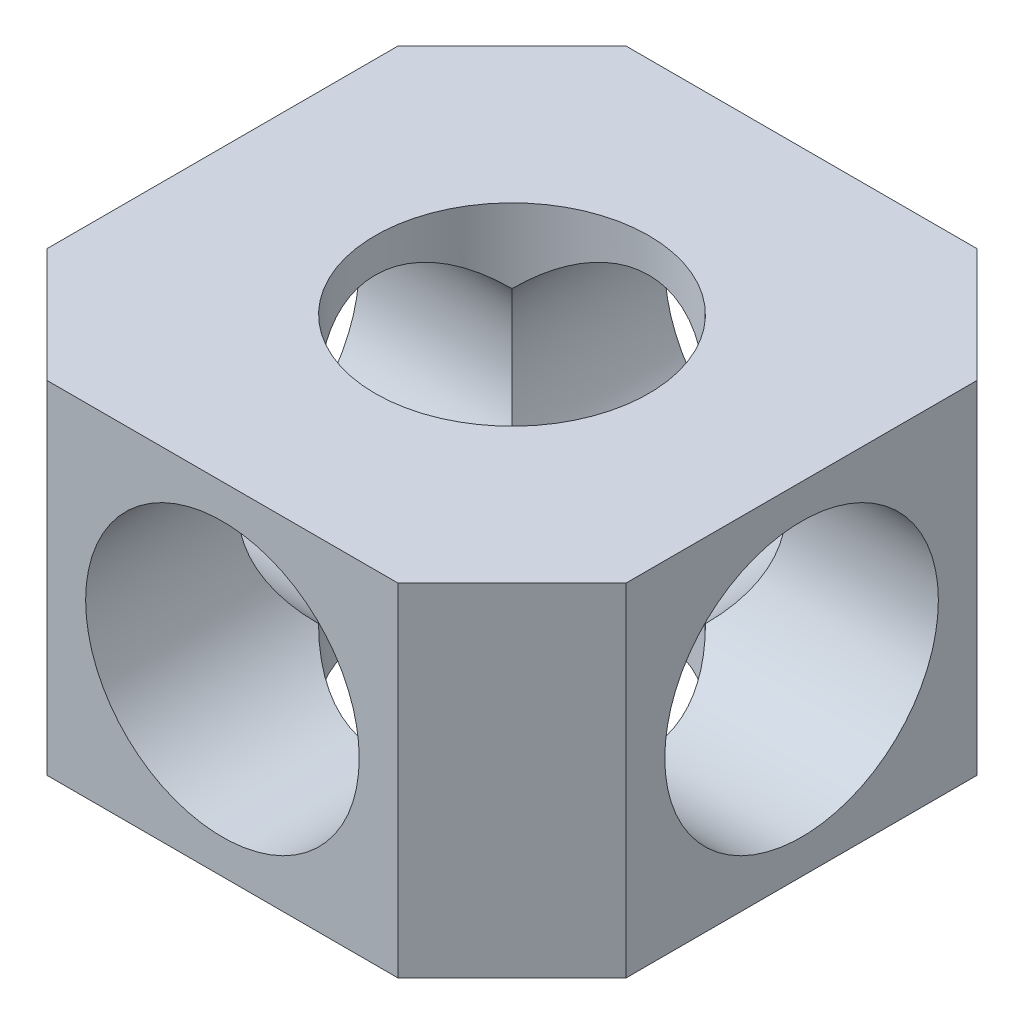
ISO-10303-21;
HEADER;
FILE_DESCRIPTION(('STEP AP214'),'2;1');
FILE_NAME('part.step','',(''),(''),'','','');
FILE_SCHEMA(('AUTOMOTIVE_DESIGN { 1 0 10303 214 1 1 1 1 }'));
ENDSEC;
DATA;
#1=APPLICATION_CONTEXT('core data for automotive mechanical design processes');
#2=APPLICATION_PROTOCOL_DEFINITION('international standard','automotive_design',2000,#1);
#3=PRODUCT_CONTEXT('',#1,'mechanical');
#4=PRODUCT('Part','Part','',(#3));
#5=PRODUCT_RELATED_PRODUCT_CATEGORY('part','',(#4));
#6=PRODUCT_DEFINITION_FORMATION('','',#4);
#7=PRODUCT_DEFINITION_CONTEXT('part definition',#1,'design');
#8=PRODUCT_DEFINITION('design','',#6,#7);
#9=PRODUCT_DEFINITION_SHAPE('','',#8);
#10=(LENGTH_UNIT() NAMED_UNIT(*) SI_UNIT(.MILLI.,.METRE.));
#11=(NAMED_UNIT(*) PLANE_ANGLE_UNIT() SI_UNIT($,.RADIAN.));
#12=(NAMED_UNIT(*) SI_UNIT($,.STERADIAN.) SOLID_ANGLE_UNIT());
#13=UNCERTAINTY_MEASURE_WITH_UNIT(LENGTH_MEASURE(1.E-05),#10,'distance_accuracy_value','');
#14=(GEOMETRIC_REPRESENTATION_CONTEXT(3) GLOBAL_UNCERTAINTY_ASSIGNED_CONTEXT((#13)) GLOBAL_UNIT_ASSIGNED_CONTEXT((#10,
#11,#12)) REPRESENTATION_CONTEXT('',''));
#15=CARTESIAN_POINT('',(0.,0.,0.));
#16=DIRECTION('',(0.,0.,1.));
#17=DIRECTION('',(1.,0.,0.));
#18=AXIS2_PLACEMENT_3D('',#15,#16,#17);
#19=CARTESIAN_POINT('',(0.,-7.5,0.));
#20=DIRECTION('',(0.,1.,0.));
#21=DIRECTION('',(0.,0.,1.));
#22=AXIS2_PLACEMENT_3D('',#19,#20,#21);
#23=CYLINDRICAL_SURFACE('',#22,6.);
#24=CARTESIAN_POINT('',(0.,7.5,0.));
#25=DIRECTION('',(0.,1.,0.));
#26=DIRECTION('',(0.,0.,1.));
#27=AXIS2_PLACEMENT_3D('',#24,#25,#26);
#28=CIRCLE('',#27,6.);
#29=CARTESIAN_POINT('',(0.,7.5,6.));
#30=VERTEX_POINT('',#29);
#31=EDGE_CURVE('E173',#30,#30,#28,.T.);
#32=ORIENTED_EDGE('',*,*,#31,.T.);
#33=EDGE_LOOP('',(#32));
#34=FACE_BOUND('',#33,.T.);
#35=CARTESIAN_POINT('',(0.,0.,0.));
#36=DIRECTION('',(0.,0.707106781186547,-0.707106781186547));
#37=DIRECTION('',(0.,0.707106781186547,0.707106781186547));
#38=AXIS2_PLACEMENT_3D('',#35,#36,#37);
#39=ELLIPSE('',#38,8.48528137423857,6.);
#40=CARTESIAN_POINT('',(4.2426406871193,4.24264068711927,4.24264068711926));
#41=VERTEX_POINT('',#40);
#42=CARTESIAN_POINT('',(-4.24264068711927,4.2426406871193,4.24264068711931));
#43=VERTEX_POINT('',#42);
#44=EDGE_CURVE('E135',#41,#43,#39,.F.);
#45=ORIENTED_EDGE('',*,*,#44,.T.);
#46=CARTESIAN_POINT('',(0.,0.,0.));
#47=DIRECTION('',(0.707106781186547,0.707106781186547,0.));
#48=DIRECTION('',(-0.707106781186547,0.707106781186547,0.));
#49=AXIS2_PLACEMENT_3D('',#46,#47,#48);
#50=ELLIPSE('',#49,8.48528137423857,6.);
#51=CARTESIAN_POINT('',(-4.2426406871193,4.24264068711927,-4.24264068711926));
#52=VERTEX_POINT('',#51);
#53=EDGE_CURVE('E167',#43,#52,#50,.F.);
#54=ORIENTED_EDGE('',*,*,#53,.T.);
#55=CARTESIAN_POINT('',(0.,0.,0.));
#56=DIRECTION('',(0.,0.707106781186547,0.707106781186547));
#57=DIRECTION('',(0.,0.707106781186547,-0.707106781186547));
#58=AXIS2_PLACEMENT_3D('',#55,#56,#57);
#59=ELLIPSE('',#58,8.48528137423857,6.);
#60=CARTESIAN_POINT('',(4.24264068711928,4.24264068711929,-4.24264068711929));
#61=VERTEX_POINT('',#60);
#62=EDGE_CURVE('E137',#52,#61,#59,.F.);
#63=ORIENTED_EDGE('',*,*,#62,.T.);
#64=CARTESIAN_POINT('',(0.,0.,0.));
#65=DIRECTION('',(-0.707106781186547,0.707106781186547,0.));
#66=DIRECTION('',(0.707106781186547,0.707106781186547,0.));
#67=AXIS2_PLACEMENT_3D('',#64,#65,#66);
#68=ELLIPSE('',#67,8.48528137423857,6.);
#69=EDGE_CURVE('E50',#61,#41,#68,.F.);
#70=ORIENTED_EDGE('',*,*,#69,.T.);
#71=EDGE_LOOP('',(#45,#54,#63,#70));
#72=FACE_BOUND('',#71,.T.);
#73=ADVANCED_FACE('F35',(#34,#72),#23,.F.);
#74=CARTESIAN_POINT('',(12.7,7.5,-12.7));
#75=DIRECTION('',(-1.,0.,0.));
#76=DIRECTION('',(0.,0.,1.));
#77=AXIS2_PLACEMENT_3D('',#74,#75,#76);
#78=PLANE('',#77);
#79=CARTESIAN_POINT('',(12.7,0.,0.));
#80=DIRECTION('',(1.,0.,0.));
#81=DIRECTION('',(0.,0.,-1.));
#82=AXIS2_PLACEMENT_3D('',#79,#80,#81);
#83=CIRCLE('',#82,6.);
#84=CARTESIAN_POINT('',(12.7,0.,-6.00000000000005));
#85=VERTEX_POINT('',#84);
#86=EDGE_CURVE('E162',#85,#85,#83,.T.);
#87=ORIENTED_EDGE('',*,*,#86,.F.);
#88=EDGE_LOOP('',(#87));
#89=FACE_BOUND('',#88,.T.);
#90=DIRECTION('',(0.,0.,-1.));
#91=VECTOR('',#90,1.);
#92=CARTESIAN_POINT('',(12.7,-7.5,-12.7));
#93=LINE('',#92,#91);
#94=CARTESIAN_POINT('',(12.7,-7.5,7.69999999999997));
#95=VERTEX_POINT('',#94);
#96=CARTESIAN_POINT('',(12.7,-7.5,-7.69999999999998));
#97=VERTEX_POINT('',#96);
#98=EDGE_CURVE('E179',#95,#97,#93,.T.);
#99=ORIENTED_EDGE('',*,*,#98,.T.);
#100=DIRECTION('',(0.,1.,0.));
#101=VECTOR('',#100,1.);
#102=CARTESIAN_POINT('',(12.7,7.5,-7.69999999999998));
#103=LINE('',#102,#101);
#104=CARTESIAN_POINT('',(12.7,7.5,-7.69999999999998));
#105=VERTEX_POINT('',#104);
#106=EDGE_CURVE('E221',#97,#105,#103,.T.);
#107=ORIENTED_EDGE('',*,*,#106,.T.);
#108=DIRECTION('',(0.,0.,-1.));
#109=VECTOR('',#108,1.);
#110=CARTESIAN_POINT('',(12.7,7.5,-12.7));
#111=LINE('',#110,#109);
#112=CARTESIAN_POINT('',(12.7,7.5,7.69999999999997));
#113=VERTEX_POINT('',#112);
#114=EDGE_CURVE('E182',#113,#105,#111,.T.);
#115=ORIENTED_EDGE('',*,*,#114,.F.);
#116=DIRECTION('',(0.,-1.,0.));
#117=VECTOR('',#116,1.);
#118=CARTESIAN_POINT('',(12.7,7.5,7.69999999999997));
#119=LINE('',#118,#117);
#120=EDGE_CURVE('E218',#113,#95,#119,.T.);
#121=ORIENTED_EDGE('',*,*,#120,.T.);
#122=EDGE_LOOP('',(#99,#107,#115,#121));
#123=FACE_BOUND('',#122,.T.);
#124=ADVANCED_FACE('F250',(#89,#123),#78,.F.);
#125=CARTESIAN_POINT('',(-12.7,7.5,-12.7));
#126=DIRECTION('',(0.,0.,1.));
#127=DIRECTION('',(1.,0.,0.));
#128=AXIS2_PLACEMENT_3D('',#125,#126,#127);
#129=PLANE('',#128);
#130=CARTESIAN_POINT('',(0.,0.,-12.7));
#131=DIRECTION('',(0.,0.,1.));
#132=DIRECTION('',(1.,0.,0.));
#133=AXIS2_PLACEMENT_3D('',#130,#131,#132);
#134=CIRCLE('',#133,6.);
#135=CARTESIAN_POINT('',(6.,0.,-12.7));
#136=VERTEX_POINT('',#135);
#137=EDGE_CURVE('E170',#136,#136,#134,.T.);
#138=ORIENTED_EDGE('',*,*,#137,.T.);
#139=EDGE_LOOP('',(#138));
#140=FACE_BOUND('',#139,.T.);
#141=DIRECTION('',(-1.,0.,0.));
#142=VECTOR('',#141,1.);
#143=CARTESIAN_POINT('',(-12.7,7.5,-12.7));
#144=LINE('',#143,#142);
#145=CARTESIAN_POINT('',(7.69999999999993,7.5,-12.7));
#146=VERTEX_POINT('',#145);
#147=CARTESIAN_POINT('',(-7.7,7.5,-12.7));
#148=VERTEX_POINT('',#147);
#149=EDGE_CURVE('E185',#146,#148,#144,.T.);
#150=ORIENTED_EDGE('',*,*,#149,.F.);
#151=DIRECTION('',(0.,-1.,0.));
#152=VECTOR('',#151,1.);
#153=CARTESIAN_POINT('',(7.69999999999994,7.5,-12.7));
#154=LINE('',#153,#152);
#155=CARTESIAN_POINT('',(7.69999999999994,-7.5,-12.7));
#156=VERTEX_POINT('',#155);
#157=EDGE_CURVE('E207',#146,#156,#154,.T.);
#158=ORIENTED_EDGE('',*,*,#157,.T.);
#159=DIRECTION('',(-1.,0.,0.));
#160=VECTOR('',#159,1.);
#161=CARTESIAN_POINT('',(-12.7,-7.5,-12.7));
#162=LINE('',#161,#160);
#163=CARTESIAN_POINT('',(-7.7,-7.5,-12.7));
#164=VERTEX_POINT('',#163);
#165=EDGE_CURVE('E198',#156,#164,#162,.T.);
#166=ORIENTED_EDGE('',*,*,#165,.T.);
#167=DIRECTION('',(0.,1.,0.));
#168=VECTOR('',#167,1.);
#169=CARTESIAN_POINT('',(-7.7,7.5,-12.7));
#170=LINE('',#169,#168);
#171=EDGE_CURVE('E195',#164,#148,#170,.T.);
#172=ORIENTED_EDGE('',*,*,#171,.T.);
#173=EDGE_LOOP('',(#150,#158,#166,#172));
#174=FACE_BOUND('',#173,.T.);
#175=ADVANCED_FACE('F261',(#140,#174),#129,.F.);
#176=CARTESIAN_POINT('',(-12.7,7.5,-12.7));
#177=DIRECTION('',(1.,0.,0.));
#178=DIRECTION('',(0.,0.,-1.));
#179=AXIS2_PLACEMENT_3D('',#176,#177,#178);
#180=PLANE('',#179);
#181=CARTESIAN_POINT('',(-12.7000000000001,0.,0.));
#182=DIRECTION('',(1.,0.,0.));
#183=DIRECTION('',(0.,0.,-1.));
#184=AXIS2_PLACEMENT_3D('',#181,#182,#183);
#185=CIRCLE('',#184,6.);
#186=CARTESIAN_POINT('',(-12.7000000000001,0.,-5.99999999999996));
#187=VERTEX_POINT('',#186);
#188=EDGE_CURVE('E159',#187,#187,#185,.T.);
#189=ORIENTED_EDGE('',*,*,#188,.T.);
#190=EDGE_LOOP('',(#189));
#191=FACE_BOUND('',#190,.T.);
#192=DIRECTION('',(0.,0.,1.));
#193=VECTOR('',#192,1.);
#194=CARTESIAN_POINT('',(-12.7,7.5,-12.7));
#195=LINE('',#194,#193);
#196=CARTESIAN_POINT('',(-12.7,7.5,-7.69999999999998));
#197=VERTEX_POINT('',#196);
#198=CARTESIAN_POINT('',(-12.7,7.5,7.69999999999998));
#199=VERTEX_POINT('',#198);
#200=EDGE_CURVE('E189',#197,#199,#195,.T.);
#201=ORIENTED_EDGE('',*,*,#200,.F.);
#202=DIRECTION('',(0.,-1.,0.));
#203=VECTOR('',#202,1.);
#204=CARTESIAN_POINT('',(-12.7,7.5,-7.69999999999999));
#205=LINE('',#204,#203);
#206=CARTESIAN_POINT('',(-12.7,-7.5,-7.69999999999999));
#207=VERTEX_POINT('',#206);
#208=EDGE_CURVE('E233',#197,#207,#205,.T.);
#209=ORIENTED_EDGE('',*,*,#208,.T.);
#210=DIRECTION('',(0.,0.,1.));
#211=VECTOR('',#210,1.);
#212=CARTESIAN_POINT('',(-12.7,-7.5,-12.7));
#213=LINE('',#212,#211);
#214=CARTESIAN_POINT('',(-12.7,-7.5,7.69999999999998));
#215=VERTEX_POINT('',#214);
#216=EDGE_CURVE('E201',#207,#215,#213,.T.);
#217=ORIENTED_EDGE('',*,*,#216,.T.);
#218=DIRECTION('',(0.,1.,0.));
#219=VECTOR('',#218,1.);
#220=CARTESIAN_POINT('',(-12.7,7.5,7.69999999999998));
#221=LINE('',#220,#219);
#222=EDGE_CURVE('E231',#215,#199,#221,.T.);
#223=ORIENTED_EDGE('',*,*,#222,.T.);
#224=EDGE_LOOP('',(#201,#209,#217,#223));
#225=FACE_BOUND('',#224,.T.);
#226=ADVANCED_FACE('F270',(#191,#225),#180,.F.);
#227=CARTESIAN_POINT('',(-12.7,7.5,12.7));
#228=DIRECTION('',(0.,0.,-1.));
#229=DIRECTION('',(-1.,0.,0.));
#230=AXIS2_PLACEMENT_3D('',#227,#228,#229);
#231=PLANE('',#230);
#232=CARTESIAN_POINT('',(0.,0.,12.7));
#233=DIRECTION('',(0.,0.,1.));
#234=DIRECTION('',(1.,0.,0.));
#235=AXIS2_PLACEMENT_3D('',#232,#233,#234);
#236=CIRCLE('',#235,6.);
#237=CARTESIAN_POINT('',(6.,0.,12.7));
#238=VERTEX_POINT('',#237);
#239=EDGE_CURVE('E169',#238,#238,#236,.T.);
#240=ORIENTED_EDGE('',*,*,#239,.F.);
#241=EDGE_LOOP('',(#240));
#242=FACE_BOUND('',#241,.T.);
#243=DIRECTION('',(1.,0.,0.));
#244=VECTOR('',#243,1.);
#245=CARTESIAN_POINT('',(-12.7,7.5,12.7));
#246=LINE('',#245,#244);
#247=CARTESIAN_POINT('',(-7.70000000000001,7.5,12.7));
#248=VERTEX_POINT('',#247);
#249=CARTESIAN_POINT('',(7.69999999999994,7.5,12.7));
#250=VERTEX_POINT('',#249);
#251=EDGE_CURVE('E192',#248,#250,#246,.T.);
#252=ORIENTED_EDGE('',*,*,#251,.F.);
#253=DIRECTION('',(0.,-1.,0.));
#254=VECTOR('',#253,1.);
#255=CARTESIAN_POINT('',(-7.70000000000001,7.5,12.7));
#256=LINE('',#255,#254);
#257=CARTESIAN_POINT('',(-7.70000000000001,-7.5,12.7));
#258=VERTEX_POINT('',#257);
#259=EDGE_CURVE('E142',#248,#258,#256,.T.);
#260=ORIENTED_EDGE('',*,*,#259,.T.);
#261=DIRECTION('',(1.,0.,0.));
#262=VECTOR('',#261,1.);
#263=CARTESIAN_POINT('',(-12.7,-7.5,12.7));
#264=LINE('',#263,#262);
#265=CARTESIAN_POINT('',(7.69999999999995,-7.5,12.7));
#266=VERTEX_POINT('',#265);
#267=EDGE_CURVE('E186',#258,#266,#264,.T.);
#268=ORIENTED_EDGE('',*,*,#267,.T.);
#269=DIRECTION('',(0.,1.,0.));
#270=VECTOR('',#269,1.);
#271=CARTESIAN_POINT('',(7.69999999999995,7.5,12.7));
#272=LINE('',#271,#270);
#273=EDGE_CURVE('E148',#266,#250,#272,.T.);
#274=ORIENTED_EDGE('',*,*,#273,.T.);
#275=EDGE_LOOP('',(#252,#260,#268,#274));
#276=FACE_BOUND('',#275,.T.);
#277=ADVANCED_FACE('F238',(#242,#276),#231,.F.);
#278=CARTESIAN_POINT('',(0.,7.5,0.));
#279=DIRECTION('',(0.,1.,0.));
#280=DIRECTION('',(0.,0.,1.));
#281=AXIS2_PLACEMENT_3D('',#278,#279,#280);
#282=PLANE('',#281);
#283=ORIENTED_EDGE('',*,*,#31,.F.);
#284=EDGE_LOOP('',(#283));
#285=FACE_BOUND('',#284,.T.);
#286=ORIENTED_EDGE('',*,*,#114,.T.);
#287=DIRECTION('',(0.707106781186548,0.,0.707106781186548));
#288=VECTOR('',#287,1.);
#289=CARTESIAN_POINT('',(10.2,7.5,-10.2));
#290=LINE('',#289,#288);
#291=EDGE_CURVE('E229',#105,#146,#290,.F.);
#292=ORIENTED_EDGE('',*,*,#291,.T.);
#293=ORIENTED_EDGE('',*,*,#149,.T.);
#294=DIRECTION('',(0.707106781186548,0.,-0.707106781186547));
#295=VECTOR('',#294,1.);
#296=CARTESIAN_POINT('',(-10.2,7.5,-10.2));
#297=LINE('',#296,#295);
#298=EDGE_CURVE('E227',#148,#197,#297,.F.);
#299=ORIENTED_EDGE('',*,*,#298,.T.);
#300=ORIENTED_EDGE('',*,*,#200,.T.);
#301=DIRECTION('',(-0.707106781186547,0.,-0.707106781186548));
#302=VECTOR('',#301,1.);
#303=CARTESIAN_POINT('',(-10.2,7.5,10.2));
#304=LINE('',#303,#302);
#305=EDGE_CURVE('E225',#199,#248,#304,.F.);
#306=ORIENTED_EDGE('',*,*,#305,.T.);
#307=ORIENTED_EDGE('',*,*,#251,.T.);
#308=DIRECTION('',(-0.707106781186548,0.,0.707106781186548));
#309=VECTOR('',#308,1.);
#310=CARTESIAN_POINT('',(10.2,7.5,10.2));
#311=LINE('',#310,#309);
#312=EDGE_CURVE('E223',#250,#113,#311,.F.);
#313=ORIENTED_EDGE('',*,*,#312,.T.);
#314=EDGE_LOOP('',(#286,#292,#293,#299,#300,#306,#307,#313));
#315=FACE_BOUND('',#314,.T.);
#316=ADVANCED_FACE('F244',(#285,#315),#282,.T.);
#317=CARTESIAN_POINT('',(0.,-7.5,0.));
#318=DIRECTION('',(0.,1.,0.));
#319=DIRECTION('',(0.,0.,1.));
#320=AXIS2_PLACEMENT_3D('',#317,#318,#319);
#321=PLANE('',#320);
#322=CARTESIAN_POINT('',(0.,-7.5,0.));
#323=DIRECTION('',(0.,1.,0.));
#324=DIRECTION('',(0.,0.,1.));
#325=AXIS2_PLACEMENT_3D('',#322,#323,#324);
#326=CIRCLE('',#325,6.);
#327=CARTESIAN_POINT('',(0.,-7.5,6.));
#328=VERTEX_POINT('',#327);
#329=EDGE_CURVE('E176',#328,#328,#326,.T.);
#330=ORIENTED_EDGE('',*,*,#329,.T.);
#331=EDGE_LOOP('',(#330));
#332=FACE_BOUND('',#331,.T.);
#333=ORIENTED_EDGE('',*,*,#165,.F.);
#334=DIRECTION('',(-0.707106781186548,0.,-0.707106781186548));
#335=VECTOR('',#334,1.);
#336=CARTESIAN_POINT('',(7.69999999999994,-7.5,-12.7));
#337=LINE('',#336,#335);
#338=EDGE_CURVE('E216',#156,#97,#337,.F.);
#339=ORIENTED_EDGE('',*,*,#338,.T.);
#340=ORIENTED_EDGE('',*,*,#98,.F.);
#341=DIRECTION('',(0.707106781186548,0.,-0.707106781186548));
#342=VECTOR('',#341,1.);
#343=CARTESIAN_POINT('',(12.7,-7.5,7.69999999999997));
#344=LINE('',#343,#342);
#345=EDGE_CURVE('E210',#95,#266,#344,.F.);
#346=ORIENTED_EDGE('',*,*,#345,.T.);
#347=ORIENTED_EDGE('',*,*,#267,.F.);
#348=DIRECTION('',(0.707106781186547,0.,0.707106781186548));
#349=VECTOR('',#348,1.);
#350=CARTESIAN_POINT('',(-7.70000000000001,-7.5,12.7));
#351=LINE('',#350,#349);
#352=EDGE_CURVE('E212',#258,#215,#351,.F.);
#353=ORIENTED_EDGE('',*,*,#352,.T.);
#354=ORIENTED_EDGE('',*,*,#216,.F.);
#355=DIRECTION('',(-0.707106781186548,0.,0.707106781186547));
#356=VECTOR('',#355,1.);
#357=CARTESIAN_POINT('',(-12.7,-7.5,-7.69999999999999));
#358=LINE('',#357,#356);
#359=EDGE_CURVE('E214',#207,#164,#358,.F.);
#360=ORIENTED_EDGE('',*,*,#359,.T.);
#361=EDGE_LOOP('',(#333,#339,#340,#346,#347,#353,#354,#360));
#362=FACE_BOUND('',#361,.T.);
#363=ADVANCED_FACE('F254',(#332,#362),#321,.F.);
#364=CARTESIAN_POINT('',(7.69999999999994,7.5,-12.7));
#365=DIRECTION('',(-0.707106781186548,0.,0.707106781186548));
#366=DIRECTION('',(0.,-1.,0.));
#367=AXIS2_PLACEMENT_3D('',#364,#365,#366);
#368=PLANE('',#367);
#369=ORIENTED_EDGE('',*,*,#291,.F.);
#370=ORIENTED_EDGE('',*,*,#106,.F.);
#371=ORIENTED_EDGE('',*,*,#338,.F.);
#372=ORIENTED_EDGE('',*,*,#157,.F.);
#373=EDGE_LOOP('',(#369,#370,#371,#372));
#374=FACE_BOUND('',#373,.T.);
#375=ADVANCED_FACE('F258',(#374),#368,.F.);
#376=CARTESIAN_POINT('',(-12.7,7.5,-7.69999999999999));
#377=DIRECTION('',(0.707106781186547,0.,0.707106781186548));
#378=DIRECTION('',(0.,-1.,0.));
#379=AXIS2_PLACEMENT_3D('',#376,#377,#378);
#380=PLANE('',#379);
#381=ORIENTED_EDGE('',*,*,#298,.F.);
#382=ORIENTED_EDGE('',*,*,#171,.F.);
#383=ORIENTED_EDGE('',*,*,#359,.F.);
#384=ORIENTED_EDGE('',*,*,#208,.F.);
#385=EDGE_LOOP('',(#381,#382,#383,#384));
#386=FACE_BOUND('',#385,.T.);
#387=ADVANCED_FACE('F267',(#386),#380,.F.);
#388=CARTESIAN_POINT('',(-7.70000000000001,7.5,12.7));
#389=DIRECTION('',(0.707106781186548,0.,-0.707106781186547));
#390=DIRECTION('',(0.,-1.,0.));
#391=AXIS2_PLACEMENT_3D('',#388,#389,#390);
#392=PLANE('',#391);
#393=ORIENTED_EDGE('',*,*,#305,.F.);
#394=ORIENTED_EDGE('',*,*,#222,.F.);
#395=ORIENTED_EDGE('',*,*,#352,.F.);
#396=ORIENTED_EDGE('',*,*,#259,.F.);
#397=EDGE_LOOP('',(#393,#394,#395,#396));
#398=FACE_BOUND('',#397,.T.);
#399=ADVANCED_FACE('F273',(#398),#392,.F.);
#400=CARTESIAN_POINT('',(12.7,7.5,7.69999999999997));
#401=DIRECTION('',(-0.707106781186548,0.,-0.707106781186548));
#402=DIRECTION('',(0.,-1.,0.));
#403=AXIS2_PLACEMENT_3D('',#400,#401,#402);
#404=PLANE('',#403);
#405=ORIENTED_EDGE('',*,*,#312,.F.);
#406=ORIENTED_EDGE('',*,*,#273,.F.);
#407=ORIENTED_EDGE('',*,*,#345,.F.);
#408=ORIENTED_EDGE('',*,*,#120,.F.);
#409=EDGE_LOOP('',(#405,#406,#407,#408));
#410=FACE_BOUND('',#409,.T.);
#411=ADVANCED_FACE('F37',(#410),#404,.F.);
#412=CARTESIAN_POINT('',(0.,0.,0.));
#413=DIRECTION('',(0.,0.707106781186547,-0.707106781186547));
#414=DIRECTION('',(0.,0.707106781186547,0.707106781186547));
#415=AXIS2_PLACEMENT_3D('',#412,#413,#414);
#416=ELLIPSE('',#415,8.48528137423857,6.);
#417=CARTESIAN_POINT('',(4.24264068711927,-4.2426406871193,-4.24264068711931));
#418=VERTEX_POINT('',#417);
#419=CARTESIAN_POINT('',(-4.24264068711929,-4.24264068711928,-4.24264068711928));
#420=VERTEX_POINT('',#419);
#421=EDGE_CURVE('E141',#418,#420,#416,.T.);
#422=ORIENTED_EDGE('',*,*,#421,.T.);
#423=CARTESIAN_POINT('',(0.,0.,0.));
#424=DIRECTION('',(-0.707106781186547,0.707106781186547,0.));
#425=DIRECTION('',(0.707106781186547,0.707106781186547,0.));
#426=AXIS2_PLACEMENT_3D('',#423,#424,#425);
#427=ELLIPSE('',#426,8.48528137423857,6.);
#428=CARTESIAN_POINT('',(-4.24264068711927,-4.2426406871193,4.24264068711931));
#429=VERTEX_POINT('',#428);
#430=EDGE_CURVE('E58',#420,#429,#427,.T.);
#431=ORIENTED_EDGE('',*,*,#430,.T.);
#432=CARTESIAN_POINT('',(0.,0.,0.));
#433=DIRECTION('',(0.,0.707106781186547,0.707106781186547));
#434=DIRECTION('',(0.,0.707106781186547,-0.707106781186547));
#435=AXIS2_PLACEMENT_3D('',#432,#433,#434);
#436=ELLIPSE('',#435,8.48528137423857,6.);
#437=CARTESIAN_POINT('',(4.2426406871193,-4.24264068711927,4.24264068711926));
#438=VERTEX_POINT('',#437);
#439=EDGE_CURVE('E145',#429,#438,#436,.T.);
#440=ORIENTED_EDGE('',*,*,#439,.T.);
#441=CARTESIAN_POINT('',(0.,0.,0.));
#442=DIRECTION('',(0.707106781186547,0.707106781186547,0.));
#443=DIRECTION('',(-0.707106781186547,0.707106781186547,0.));
#444=AXIS2_PLACEMENT_3D('',#441,#442,#443);
#445=ELLIPSE('',#444,8.48528137423857,6.);
#446=EDGE_CURVE('E124',#438,#418,#445,.T.);
#447=ORIENTED_EDGE('',*,*,#446,.T.);
#448=EDGE_LOOP('',(#422,#431,#440,#447));
#449=FACE_BOUND('',#448,.T.);
#450=ORIENTED_EDGE('',*,*,#329,.F.);
#451=EDGE_LOOP('',(#450));
#452=FACE_BOUND('',#451,.T.);
#453=ADVANCED_FACE('F157',(#449,#452),#23,.F.);
#454=CARTESIAN_POINT('',(0.,0.,-12.7));
#455=DIRECTION('',(0.,0.,1.));
#456=DIRECTION('',(1.,0.,0.));
#457=AXIS2_PLACEMENT_3D('',#454,#455,#456);
#458=CYLINDRICAL_SURFACE('',#457,6.);
#459=ORIENTED_EDGE('',*,*,#239,.T.);
#460=EDGE_LOOP('',(#459));
#461=FACE_BOUND('',#460,.T.);
#462=ORIENTED_EDGE('',*,*,#439,.F.);
#463=CARTESIAN_POINT('',(0.,0.,0.));
#464=DIRECTION('',(-0.707106781186551,0.,-0.707106781186544));
#465=DIRECTION('',(0.707106781186544,0.,-0.707106781186551));
#466=AXIS2_PLACEMENT_3D('',#463,#464,#465);
#467=ELLIPSE('',#466,8.48528137423862,6.);
#468=EDGE_CURVE('E129',#429,#43,#467,.T.);
#469=ORIENTED_EDGE('',*,*,#468,.T.);
#470=ORIENTED_EDGE('',*,*,#44,.F.);
#471=CARTESIAN_POINT('',(0.,0.,0.));
#472=DIRECTION('',(0.707106781186544,0.,-0.707106781186551));
#473=DIRECTION('',(-0.707106781186551,0.,-0.707106781186544));
#474=AXIS2_PLACEMENT_3D('',#471,#472,#473);
#475=ELLIPSE('',#474,8.48528137423853,6.);
#476=EDGE_CURVE('E121',#41,#438,#475,.T.);
#477=ORIENTED_EDGE('',*,*,#476,.T.);
#478=EDGE_LOOP('',(#462,#469,#470,#477));
#479=FACE_BOUND('',#478,.T.);
#480=ADVANCED_FACE('F140',(#461,#479),#458,.F.);
#481=ORIENTED_EDGE('',*,*,#137,.F.);
#482=EDGE_LOOP('',(#481));
#483=FACE_BOUND('',#482,.T.);
#484=ORIENTED_EDGE('',*,*,#62,.F.);
#485=CARTESIAN_POINT('',(0.,0.,0.));
#486=DIRECTION('',(-0.707106781186546,0.,0.707106781186549));
#487=DIRECTION('',(0.707106781186549,0.,0.707106781186546));
#488=AXIS2_PLACEMENT_3D('',#485,#486,#487);
#489=ELLIPSE('',#488,8.48528137423856,6.);
#490=EDGE_CURVE('E11',#52,#420,#489,.T.);
#491=ORIENTED_EDGE('',*,*,#490,.T.);
#492=ORIENTED_EDGE('',*,*,#421,.F.);
#493=CARTESIAN_POINT('',(0.,0.,0.));
#494=DIRECTION('',(0.707106781186549,0.,0.707106781186546));
#495=DIRECTION('',(-0.707106781186546,0.,0.707106781186549));
#496=AXIS2_PLACEMENT_3D('',#493,#494,#495);
#497=ELLIPSE('',#496,8.48528137423859,6.);
#498=EDGE_CURVE('E43',#418,#61,#497,.T.);
#499=ORIENTED_EDGE('',*,*,#498,.T.);
#500=EDGE_LOOP('',(#484,#491,#492,#499));
#501=FACE_BOUND('',#500,.T.);
#502=ADVANCED_FACE('F155',(#483,#501),#458,.F.);
#503=CARTESIAN_POINT('',(-12.7000000000001,0.,0.));
#504=DIRECTION('',(1.,0.,0.));
#505=DIRECTION('',(0.,0.,-1.));
#506=AXIS2_PLACEMENT_3D('',#503,#504,#505);
#507=CYLINDRICAL_SURFACE('',#506,6.);
#508=ORIENTED_EDGE('',*,*,#86,.T.);
#509=EDGE_LOOP('',(#508));
#510=FACE_BOUND('',#509,.T.);
#511=ORIENTED_EDGE('',*,*,#498,.F.);
#512=ORIENTED_EDGE('',*,*,#446,.F.);
#513=ORIENTED_EDGE('',*,*,#476,.F.);
#514=ORIENTED_EDGE('',*,*,#69,.F.);
#515=EDGE_LOOP('',(#511,#512,#513,#514));
#516=FACE_BOUND('',#515,.T.);
#517=ADVANCED_FACE('F122',(#510,#516),#507,.F.);
#518=ORIENTED_EDGE('',*,*,#188,.F.);
#519=EDGE_LOOP('',(#518));
#520=FACE_BOUND('',#519,.T.);
#521=ORIENTED_EDGE('',*,*,#468,.F.);
#522=ORIENTED_EDGE('',*,*,#430,.F.);
#523=ORIENTED_EDGE('',*,*,#490,.F.);
#524=ORIENTED_EDGE('',*,*,#53,.F.);
#525=EDGE_LOOP('',(#521,#522,#523,#524));
#526=FACE_BOUND('',#525,.T.);
#527=ADVANCED_FACE('F300',(#520,#526),#507,.F.);
#528=CLOSED_SHELL('',(#73,#124,#175,#226,#277,#316,#363,#375,#387,#399,#411,#453,#480,#502,#517,#527));
#529=MANIFOLD_SOLID_BREP('B2',#528);
#530=ADVANCED_BREP_SHAPE_REPRESENTATION('',(#18,#529),#14);
#531=SHAPE_DEFINITION_REPRESENTATION(#9,#530);
ENDSEC;
END-ISO-10303-21;
